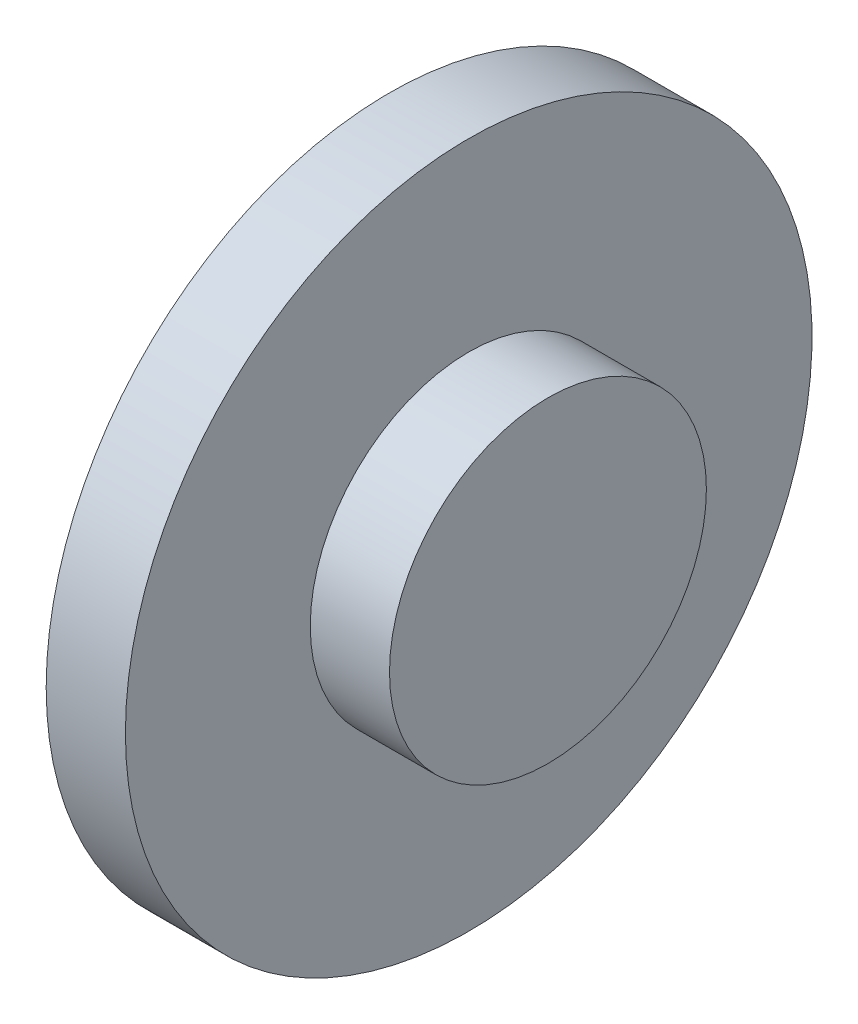
ISO-10303-21;
HEADER;
FILE_DESCRIPTION(('STEP AP214'),'2;1');
FILE_NAME('part.step','',(''),(''),'','','');
FILE_SCHEMA(('AUTOMOTIVE_DESIGN { 1 0 10303 214 1 1 1 1 }'));
ENDSEC;
DATA;
#1=APPLICATION_CONTEXT('core data for automotive mechanical design processes');
#2=APPLICATION_PROTOCOL_DEFINITION('international standard','automotive_design',2000,#1);
#3=PRODUCT_CONTEXT('',#1,'mechanical');
#4=PRODUCT('Part','Part','',(#3));
#5=PRODUCT_RELATED_PRODUCT_CATEGORY('part','',(#4));
#6=PRODUCT_DEFINITION_FORMATION('','',#4);
#7=PRODUCT_DEFINITION_CONTEXT('part definition',#1,'design');
#8=PRODUCT_DEFINITION('design','',#6,#7);
#9=PRODUCT_DEFINITION_SHAPE('','',#8);
#10=(LENGTH_UNIT() NAMED_UNIT(*) SI_UNIT(.MILLI.,.METRE.));
#11=(NAMED_UNIT(*) PLANE_ANGLE_UNIT() SI_UNIT($,.RADIAN.));
#12=(NAMED_UNIT(*) SI_UNIT($,.STERADIAN.) SOLID_ANGLE_UNIT());
#13=UNCERTAINTY_MEASURE_WITH_UNIT(LENGTH_MEASURE(1.E-05),#10,'distance_accuracy_value','');
#14=(GEOMETRIC_REPRESENTATION_CONTEXT(3) GLOBAL_UNCERTAINTY_ASSIGNED_CONTEXT((#13)) GLOBAL_UNIT_ASSIGNED_CONTEXT((#10,
#11,#12)) REPRESENTATION_CONTEXT('',''));
#15=CARTESIAN_POINT('',(0.,0.,0.));
#16=DIRECTION('',(0.,0.,1.));
#17=DIRECTION('',(1.,0.,0.));
#18=AXIS2_PLACEMENT_3D('',#15,#16,#17);
#19=CARTESIAN_POINT('',(0.,0.,0.));
#20=DIRECTION('',(1.,0.,0.));
#21=DIRECTION('',(0.,0.,-1.));
#22=AXIS2_PLACEMENT_3D('',#19,#20,#21);
#23=PLANE('',#22);
#24=CARTESIAN_POINT('',(0.,0.,0.));
#25=DIRECTION('',(-1.,0.,0.));
#26=DIRECTION('',(0.,0.,1.));
#27=AXIS2_PLACEMENT_3D('',#24,#25,#26);
#28=CIRCLE('',#27,13.);
#29=CARTESIAN_POINT('',(0.,0.,13.));
#30=VERTEX_POINT('',#29);
#31=EDGE_CURVE('E12',#30,#30,#28,.T.);
#32=ORIENTED_EDGE('',*,*,#31,.T.);
#33=EDGE_LOOP('',(#32));
#34=FACE_BOUND('',#33,.T.);
#35=ADVANCED_FACE('F45',(#34),#23,.F.);
#36=CARTESIAN_POINT('',(0.,0.,0.));
#37=DIRECTION('',(-1.,0.,0.));
#38=DIRECTION('',(0.,0.,1.));
#39=AXIS2_PLACEMENT_3D('',#36,#37,#38);
#40=CYLINDRICAL_SURFACE('',#39,13.);
#41=ORIENTED_EDGE('',*,*,#31,.F.);
#42=EDGE_LOOP('',(#41));
#43=FACE_BOUND('',#42,.T.);
#44=CARTESIAN_POINT('',(3.,0.,0.));
#45=DIRECTION('',(-1.,0.,0.));
#46=DIRECTION('',(0.,0.,1.));
#47=AXIS2_PLACEMENT_3D('',#44,#45,#46);
#48=CIRCLE('',#47,13.);
#49=CARTESIAN_POINT('',(3.,0.,13.));
#50=VERTEX_POINT('',#49);
#51=EDGE_CURVE('E51',#50,#50,#48,.T.);
#52=ORIENTED_EDGE('',*,*,#51,.T.);
#53=EDGE_LOOP('',(#52));
#54=FACE_BOUND('',#53,.T.);
#55=ADVANCED_FACE('F77',(#43,#54),#40,.T.);
#56=CARTESIAN_POINT('',(3.,13.,0.));
#57=DIRECTION('',(-1.,0.,0.));
#58=DIRECTION('',(0.,0.,1.));
#59=AXIS2_PLACEMENT_3D('',#56,#57,#58);
#60=PLANE('',#59);
#61=ORIENTED_EDGE('',*,*,#51,.F.);
#62=EDGE_LOOP('',(#61));
#63=FACE_BOUND('',#62,.T.);
#64=CARTESIAN_POINT('',(3.,0.,0.));
#65=DIRECTION('',(-1.,0.,0.));
#66=DIRECTION('',(0.,0.,1.));
#67=AXIS2_PLACEMENT_3D('',#64,#65,#66);
#68=CIRCLE('',#67,6.);
#69=CARTESIAN_POINT('',(3.,0.,6.));
#70=VERTEX_POINT('',#69);
#71=EDGE_CURVE('E55',#70,#70,#68,.T.);
#72=ORIENTED_EDGE('',*,*,#71,.T.);
#73=EDGE_LOOP('',(#72));
#74=FACE_BOUND('',#73,.T.);
#75=ADVANCED_FACE('F73',(#63,#74),#60,.F.);
#76=CARTESIAN_POINT('',(0.,0.,0.));
#77=DIRECTION('',(-1.,0.,0.));
#78=DIRECTION('',(0.,0.,1.));
#79=AXIS2_PLACEMENT_3D('',#76,#77,#78);
#80=CYLINDRICAL_SURFACE('',#79,6.);
#81=ORIENTED_EDGE('',*,*,#71,.F.);
#82=EDGE_LOOP('',(#81));
#83=FACE_BOUND('',#82,.T.);
#84=CARTESIAN_POINT('',(6.,0.,0.));
#85=DIRECTION('',(-1.,0.,0.));
#86=DIRECTION('',(0.,0.,1.));
#87=AXIS2_PLACEMENT_3D('',#84,#85,#86);
#88=CIRCLE('',#87,6.);
#89=CARTESIAN_POINT('',(6.,0.,6.));
#90=VERTEX_POINT('',#89);
#91=EDGE_CURVE('E59',#90,#90,#88,.T.);
#92=ORIENTED_EDGE('',*,*,#91,.T.);
#93=EDGE_LOOP('',(#92));
#94=FACE_BOUND('',#93,.T.);
#95=ADVANCED_FACE('F65',(#83,#94),#80,.T.);
#96=CARTESIAN_POINT('',(6.,6.,0.));
#97=DIRECTION('',(-1.,0.,0.));
#98=DIRECTION('',(0.,0.,1.));
#99=AXIS2_PLACEMENT_3D('',#96,#97,#98);
#100=PLANE('',#99);
#101=ORIENTED_EDGE('',*,*,#91,.F.);
#102=EDGE_LOOP('',(#101));
#103=FACE_BOUND('',#102,.T.);
#104=ADVANCED_FACE('F67',(#103),#100,.F.);
#105=CLOSED_SHELL('',(#35,#55,#75,#95,#104));
#106=MANIFOLD_SOLID_BREP('B2',#105);
#107=ADVANCED_BREP_SHAPE_REPRESENTATION('',(#18,#106),#14);
#108=SHAPE_DEFINITION_REPRESENTATION(#9,#107);
ENDSEC;
END-ISO-10303-21;
